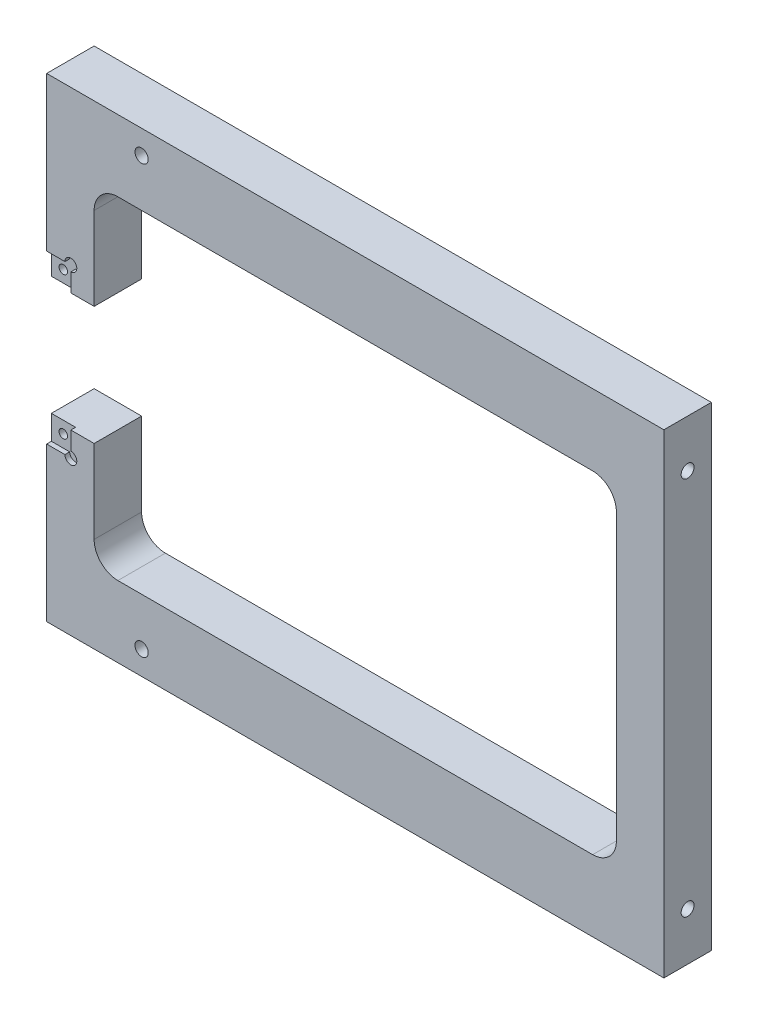
ISO-10303-21;
HEADER;
FILE_DESCRIPTION(('STEP AP214'),'2;1');
FILE_NAME('part.step','',(''),(''),'','','');
FILE_SCHEMA(('AUTOMOTIVE_DESIGN { 1 0 10303 214 1 1 1 1 }'));
ENDSEC;
DATA;
#1=APPLICATION_CONTEXT('core data for automotive mechanical design processes');
#2=APPLICATION_PROTOCOL_DEFINITION('international standard','automotive_design',2000,#1);
#3=PRODUCT_CONTEXT('',#1,'mechanical');
#4=PRODUCT('Part','Part','',(#3));
#5=PRODUCT_RELATED_PRODUCT_CATEGORY('part','',(#4));
#6=PRODUCT_DEFINITION_FORMATION('','',#4);
#7=PRODUCT_DEFINITION_CONTEXT('part definition',#1,'design');
#8=PRODUCT_DEFINITION('design','',#6,#7);
#9=PRODUCT_DEFINITION_SHAPE('','',#8);
#10=(LENGTH_UNIT() NAMED_UNIT(*) SI_UNIT(.MILLI.,.METRE.));
#11=(NAMED_UNIT(*) PLANE_ANGLE_UNIT() SI_UNIT($,.RADIAN.));
#12=(NAMED_UNIT(*) SI_UNIT($,.STERADIAN.) SOLID_ANGLE_UNIT());
#13=UNCERTAINTY_MEASURE_WITH_UNIT(LENGTH_MEASURE(1.E-05),#10,'distance_accuracy_value','');
#14=(GEOMETRIC_REPRESENTATION_CONTEXT(3) GLOBAL_UNCERTAINTY_ASSIGNED_CONTEXT((#13)) GLOBAL_UNIT_ASSIGNED_CONTEXT((#10,
#11,#12)) REPRESENTATION_CONTEXT('',''));
#15=CARTESIAN_POINT('',(0.,0.,0.));
#16=DIRECTION('',(0.,0.,1.));
#17=DIRECTION('',(1.,0.,0.));
#18=AXIS2_PLACEMENT_3D('',#15,#16,#17);
#19=CARTESIAN_POINT('',(-82.55,63.5,12.7));
#20=DIRECTION('',(1.,0.,0.));
#21=DIRECTION('',(0.,1.,0.));
#22=AXIS2_PLACEMENT_3D('',#19,#20,#21);
#23=PLANE('',#22);
#24=CARTESIAN_POINT('',(-82.55,50.8,6.35));
#25=DIRECTION('',(-1.,0.,0.));
#26=DIRECTION('',(0.,0.,1.));
#27=AXIS2_PLACEMENT_3D('',#24,#25,#26);
#28=CIRCLE('',#27,1.72719999999999);
#29=CARTESIAN_POINT('',(-82.55,50.8,8.07719999999999));
#30=VERTEX_POINT('',#29);
#31=EDGE_CURVE('E519',#30,#30,#28,.T.);
#32=ORIENTED_EDGE('',*,*,#31,.F.);
#33=EDGE_LOOP('',(#32));
#34=FACE_BOUND('',#33,.T.);
#35=DIRECTION('',(0.,0.,1.));
#36=VECTOR('',#35,1.);
#37=CARTESIAN_POINT('',(-82.55,22.352,11.43));
#38=LINE('',#37,#36);
#39=CARTESIAN_POINT('',(-82.55,22.352,11.43));
#40=VERTEX_POINT('',#39);
#41=CARTESIAN_POINT('',(-82.55,22.352,12.7));
#42=VERTEX_POINT('',#41);
#43=EDGE_CURVE('E235',#40,#42,#38,.T.);
#44=ORIENTED_EDGE('',*,*,#43,.T.);
#45=DIRECTION('',(0.,-1.,0.));
#46=VECTOR('',#45,1.);
#47=CARTESIAN_POINT('',(-82.55,63.5,12.7));
#48=LINE('',#47,#46);
#49=CARTESIAN_POINT('',(-82.55,63.5,12.7));
#50=VERTEX_POINT('',#49);
#51=EDGE_CURVE('E299',#50,#42,#48,.T.);
#52=ORIENTED_EDGE('',*,*,#51,.F.);
#53=DIRECTION('',(0.,0.,-1.));
#54=VECTOR('',#53,1.);
#55=CARTESIAN_POINT('',(-82.55,63.5,12.7));
#56=LINE('',#55,#54);
#57=CARTESIAN_POINT('',(-82.55,63.5,0.));
#58=VERTEX_POINT('',#57);
#59=EDGE_CURVE('E309',#50,#58,#56,.T.);
#60=ORIENTED_EDGE('',*,*,#59,.T.);
#61=DIRECTION('',(0.,-1.,0.));
#62=VECTOR('',#61,1.);
#63=CARTESIAN_POINT('',(-82.55,63.5,0.));
#64=LINE('',#63,#62);
#65=CARTESIAN_POINT('',(-82.55,15.875,0.));
#66=VERTEX_POINT('',#65);
#67=EDGE_CURVE('E310',#58,#66,#64,.T.);
#68=ORIENTED_EDGE('',*,*,#67,.T.);
#69=DIRECTION('',(0.,0.,-1.));
#70=VECTOR('',#69,1.);
#71=CARTESIAN_POINT('',(-82.55,15.875,12.7));
#72=LINE('',#71,#70);
#73=CARTESIAN_POINT('',(-82.55,15.875,11.43));
#74=VERTEX_POINT('',#73);
#75=EDGE_CURVE('E272',#74,#66,#72,.T.);
#76=ORIENTED_EDGE('',*,*,#75,.F.);
#77=DIRECTION('',(0.,-1.,0.));
#78=VECTOR('',#77,1.);
#79=CARTESIAN_POINT('',(-82.55,22.352,11.43));
#80=LINE('',#79,#78);
#81=EDGE_CURVE('E249',#40,#74,#80,.T.);
#82=ORIENTED_EDGE('',*,*,#81,.F.);
#83=EDGE_LOOP('',(#44,#52,#60,#68,#76,#82));
#84=FACE_BOUND('',#83,.T.);
#85=ADVANCED_FACE('F40',(#34,#84),#23,.F.);
#86=CARTESIAN_POINT('',(0.,0.,12.7));
#87=DIRECTION('',(0.,0.,1.));
#88=DIRECTION('',(1.,0.,0.));
#89=AXIS2_PLACEMENT_3D('',#86,#87,#88);
#90=PLANE('',#89);
#91=CARTESIAN_POINT('',(-76.073,22.352,12.7));
#92=DIRECTION('',(0.,0.,1.));
#93=DIRECTION('',(1.,0.,0.));
#94=AXIS2_PLACEMENT_3D('',#91,#92,#93);
#95=CIRCLE('',#94,1.5875);
#96=CARTESIAN_POINT('',(-76.073,20.7645,12.7));
#97=VERTEX_POINT('',#96);
#98=CARTESIAN_POINT('',(-77.6605,22.352,12.7));
#99=VERTEX_POINT('',#98);
#100=EDGE_CURVE('E216',#97,#99,#95,.T.);
#101=ORIENTED_EDGE('',*,*,#100,.F.);
#102=DIRECTION('',(0.,-1.,0.));
#103=VECTOR('',#102,1.);
#104=CARTESIAN_POINT('',(-76.073,22.352,12.7));
#105=LINE('',#104,#103);
#106=CARTESIAN_POINT('',(-76.073,15.875,12.7));
#107=VERTEX_POINT('',#106);
#108=EDGE_CURVE('E244',#97,#107,#105,.T.);
#109=ORIENTED_EDGE('',*,*,#108,.T.);
#110=DIRECTION('',(-1.,0.,0.));
#111=VECTOR('',#110,1.);
#112=CARTESIAN_POINT('',(-69.85,15.875,12.7));
#113=LINE('',#112,#111);
#114=CARTESIAN_POINT('',(-69.85,15.875,12.7));
#115=VERTEX_POINT('',#114);
#116=EDGE_CURVE('E269',#115,#107,#113,.T.);
#117=ORIENTED_EDGE('',*,*,#116,.F.);
#118=DIRECTION('',(0.,-1.,0.));
#119=VECTOR('',#118,1.);
#120=CARTESIAN_POINT('',(-69.85,44.45,12.7));
#121=LINE('',#120,#119);
#122=CARTESIAN_POINT('',(-69.85,38.1,12.7));
#123=VERTEX_POINT('',#122);
#124=EDGE_CURVE('E267',#123,#115,#121,.T.);
#125=ORIENTED_EDGE('',*,*,#124,.F.);
#126=CARTESIAN_POINT('',(-63.5,38.1,12.7));
#127=DIRECTION('',(0.,0.,1.));
#128=DIRECTION('',(1.,0.,0.));
#129=AXIS2_PLACEMENT_3D('',#126,#127,#128);
#130=CIRCLE('',#129,6.35);
#131=CARTESIAN_POINT('',(-63.5,44.45,12.7));
#132=VERTEX_POINT('',#131);
#133=EDGE_CURVE('E11',#123,#132,#130,.F.);
#134=ORIENTED_EDGE('',*,*,#133,.T.);
#135=DIRECTION('',(-1.,0.,0.));
#136=VECTOR('',#135,1.);
#137=CARTESIAN_POINT('',(69.85,44.45,12.7));
#138=LINE('',#137,#136);
#139=CARTESIAN_POINT('',(63.5,44.45,12.7));
#140=VERTEX_POINT('',#139);
#141=EDGE_CURVE('E264',#140,#132,#138,.T.);
#142=ORIENTED_EDGE('',*,*,#141,.F.);
#143=CARTESIAN_POINT('',(63.5,38.1,12.7));
#144=DIRECTION('',(0.,0.,1.));
#145=DIRECTION('',(1.,0.,0.));
#146=AXIS2_PLACEMENT_3D('',#143,#144,#145);
#147=CIRCLE('',#146,6.35);
#148=CARTESIAN_POINT('',(69.85,38.1,12.7));
#149=VERTEX_POINT('',#148);
#150=EDGE_CURVE('E359',#140,#149,#147,.F.);
#151=ORIENTED_EDGE('',*,*,#150,.T.);
#152=DIRECTION('',(0.,1.,0.));
#153=VECTOR('',#152,1.);
#154=CARTESIAN_POINT('',(69.85,-44.45,12.7));
#155=LINE('',#154,#153);
#156=CARTESIAN_POINT('',(69.85,-38.1,12.7));
#157=VERTEX_POINT('',#156);
#158=EDGE_CURVE('E261',#157,#149,#155,.T.);
#159=ORIENTED_EDGE('',*,*,#158,.F.);
#160=CARTESIAN_POINT('',(63.5,-38.1,12.7));
#161=DIRECTION('',(0.,0.,1.));
#162=DIRECTION('',(1.,0.,0.));
#163=AXIS2_PLACEMENT_3D('',#160,#161,#162);
#164=CIRCLE('',#163,6.35);
#165=CARTESIAN_POINT('',(63.4999999999999,-44.45,12.7));
#166=VERTEX_POINT('',#165);
#167=EDGE_CURVE('E355',#157,#166,#164,.F.);
#168=ORIENTED_EDGE('',*,*,#167,.T.);
#169=DIRECTION('',(1.,0.,0.));
#170=VECTOR('',#169,1.);
#171=CARTESIAN_POINT('',(-69.85,-44.45,12.7));
#172=LINE('',#171,#170);
#173=CARTESIAN_POINT('',(-63.5,-44.45,12.7));
#174=VERTEX_POINT('',#173);
#175=EDGE_CURVE('E258',#174,#166,#172,.T.);
#176=ORIENTED_EDGE('',*,*,#175,.F.);
#177=CARTESIAN_POINT('',(-63.5,-38.1,12.7));
#178=DIRECTION('',(0.,0.,1.));
#179=DIRECTION('',(1.,0.,0.));
#180=AXIS2_PLACEMENT_3D('',#177,#178,#179);
#181=CIRCLE('',#180,6.35);
#182=CARTESIAN_POINT('',(-69.85,-38.1,12.7));
#183=VERTEX_POINT('',#182);
#184=EDGE_CURVE('E337',#174,#183,#181,.F.);
#185=ORIENTED_EDGE('',*,*,#184,.T.);
#186=DIRECTION('',(0.,-1.,0.));
#187=VECTOR('',#186,1.);
#188=CARTESIAN_POINT('',(-69.85,-15.875,12.7));
#189=LINE('',#188,#187);
#190=CARTESIAN_POINT('',(-69.85,-15.875,12.7));
#191=VERTEX_POINT('',#190);
#192=EDGE_CURVE('E254',#191,#183,#189,.T.);
#193=ORIENTED_EDGE('',*,*,#192,.F.);
#194=DIRECTION('',(1.,0.,0.));
#195=VECTOR('',#194,1.);
#196=CARTESIAN_POINT('',(-82.55,-15.875,12.7));
#197=LINE('',#196,#195);
#198=CARTESIAN_POINT('',(-76.073,-15.875,12.7));
#199=VERTEX_POINT('',#198);
#200=EDGE_CURVE('E252',#199,#191,#197,.T.);
#201=ORIENTED_EDGE('',*,*,#200,.F.);
#202=DIRECTION('',(0.,1.,0.));
#203=VECTOR('',#202,1.);
#204=CARTESIAN_POINT('',(-76.073,-15.875,12.7));
#205=LINE('',#204,#203);
#206=CARTESIAN_POINT('',(-76.073,-20.7645,12.7));
#207=VERTEX_POINT('',#206);
#208=EDGE_CURVE('E442',#207,#199,#205,.T.);
#209=ORIENTED_EDGE('',*,*,#208,.F.);
#210=CARTESIAN_POINT('',(-76.073,-22.352,12.7));
#211=DIRECTION('',(0.,0.,1.));
#212=DIRECTION('',(1.,0.,0.));
#213=AXIS2_PLACEMENT_3D('',#210,#211,#212);
#214=CIRCLE('',#213,1.5875);
#215=CARTESIAN_POINT('',(-77.6605,-22.352,12.7));
#216=VERTEX_POINT('',#215);
#217=EDGE_CURVE('E220',#216,#207,#214,.T.);
#218=ORIENTED_EDGE('',*,*,#217,.F.);
#219=DIRECTION('',(1.,0.,0.));
#220=VECTOR('',#219,1.);
#221=CARTESIAN_POINT('',(-82.55,-22.352,12.7));
#222=LINE('',#221,#220);
#223=CARTESIAN_POINT('',(-82.55,-22.352,12.7));
#224=VERTEX_POINT('',#223);
#225=EDGE_CURVE('E449',#224,#216,#222,.T.);
#226=ORIENTED_EDGE('',*,*,#225,.F.);
#227=CARTESIAN_POINT('',(-82.55,-63.5,12.7));
#228=VERTEX_POINT('',#227);
#229=EDGE_CURVE('E303',#224,#228,#48,.T.);
#230=ORIENTED_EDGE('',*,*,#229,.T.);
#231=DIRECTION('',(1.,0.,0.));
#232=VECTOR('',#231,1.);
#233=CARTESIAN_POINT('',(-82.55,-63.5,12.7));
#234=LINE('',#233,#232);
#235=CARTESIAN_POINT('',(82.55,-63.5,12.7));
#236=VERTEX_POINT('',#235);
#237=EDGE_CURVE('E302',#228,#236,#234,.T.);
#238=ORIENTED_EDGE('',*,*,#237,.T.);
#239=DIRECTION('',(0.,1.,0.));
#240=VECTOR('',#239,1.);
#241=CARTESIAN_POINT('',(82.55,63.5,12.7));
#242=LINE('',#241,#240);
#243=CARTESIAN_POINT('',(82.55,63.5,12.7));
#244=VERTEX_POINT('',#243);
#245=EDGE_CURVE('E305',#236,#244,#242,.T.);
#246=ORIENTED_EDGE('',*,*,#245,.T.);
#247=DIRECTION('',(-1.,0.,0.));
#248=VECTOR('',#247,1.);
#249=CARTESIAN_POINT('',(-82.55,63.5,12.7));
#250=LINE('',#249,#248);
#251=EDGE_CURVE('E307',#244,#50,#250,.T.);
#252=ORIENTED_EDGE('',*,*,#251,.T.);
#253=ORIENTED_EDGE('',*,*,#51,.T.);
#254=DIRECTION('',(1.,0.,0.));
#255=VECTOR('',#254,1.);
#256=CARTESIAN_POINT('',(-82.55,22.352,12.7));
#257=LINE('',#256,#255);
#258=EDGE_CURVE('E246',#42,#99,#257,.T.);
#259=ORIENTED_EDGE('',*,*,#258,.T.);
#260=EDGE_LOOP('',(#101,#109,#117,#125,#134,#142,#151,#159,#168,#176,#185,#193,#201,#209,#218,
#226,#230,#238,#246,#252,#253,#259));
#261=FACE_BOUND('',#260,.T.);
#262=CARTESIAN_POINT('',(-57.15,57.15,12.7));
#263=DIRECTION('',(0.,0.,1.));
#264=DIRECTION('',(1.,0.,0.));
#265=AXIS2_PLACEMENT_3D('',#262,#263,#264);
#266=CIRCLE('',#265,1.778);
#267=CARTESIAN_POINT('',(-55.372,57.15,12.7));
#268=VERTEX_POINT('',#267);
#269=EDGE_CURVE('E477',#268,#268,#266,.T.);
#270=ORIENTED_EDGE('',*,*,#269,.F.);
#271=EDGE_LOOP('',(#270));
#272=FACE_BOUND('',#271,.T.);
#273=CARTESIAN_POINT('',(-57.15,-57.15,12.7));
#274=DIRECTION('',(0.,0.,1.));
#275=DIRECTION('',(1.,0.,0.));
#276=AXIS2_PLACEMENT_3D('',#273,#274,#275);
#277=CIRCLE('',#276,1.778);
#278=CARTESIAN_POINT('',(-55.372,-57.15,12.7));
#279=VERTEX_POINT('',#278);
#280=EDGE_CURVE('E481',#279,#279,#277,.T.);
#281=ORIENTED_EDGE('',*,*,#280,.F.);
#282=EDGE_LOOP('',(#281));
#283=FACE_BOUND('',#282,.T.);
#284=ADVANCED_FACE('F364',(#261,#272,#283),#90,.T.);
#285=CARTESIAN_POINT('',(-69.85,15.875,12.7));
#286=DIRECTION('',(0.,-1.,0.));
#287=DIRECTION('',(1.,0.,0.));
#288=AXIS2_PLACEMENT_3D('',#285,#286,#287);
#289=PLANE('',#288);
#290=ORIENTED_EDGE('',*,*,#116,.T.);
#291=DIRECTION('',(0.,0.,1.));
#292=VECTOR('',#291,1.);
#293=CARTESIAN_POINT('',(-76.073,15.875,11.43));
#294=LINE('',#293,#292);
#295=CARTESIAN_POINT('',(-76.073,15.875,11.43));
#296=VERTEX_POINT('',#295);
#297=EDGE_CURVE('E236',#296,#107,#294,.T.);
#298=ORIENTED_EDGE('',*,*,#297,.F.);
#299=DIRECTION('',(1.,0.,0.));
#300=VECTOR('',#299,1.);
#301=CARTESIAN_POINT('',(-82.55,15.875,11.43));
#302=LINE('',#301,#300);
#303=EDGE_CURVE('E240',#74,#296,#302,.T.);
#304=ORIENTED_EDGE('',*,*,#303,.F.);
#305=ORIENTED_EDGE('',*,*,#75,.T.);
#306=DIRECTION('',(-1.,0.,0.));
#307=VECTOR('',#306,1.);
#308=CARTESIAN_POINT('',(-69.85,15.875,0.));
#309=LINE('',#308,#307);
#310=CARTESIAN_POINT('',(-69.85,15.875,0.));
#311=VERTEX_POINT('',#310);
#312=EDGE_CURVE('E255',#311,#66,#309,.T.);
#313=ORIENTED_EDGE('',*,*,#312,.F.);
#314=DIRECTION('',(0.,0.,-1.));
#315=VECTOR('',#314,1.);
#316=CARTESIAN_POINT('',(-69.85,15.875,12.7));
#317=LINE('',#316,#315);
#318=EDGE_CURVE('E291',#115,#311,#317,.T.);
#319=ORIENTED_EDGE('',*,*,#318,.F.);
#320=EDGE_LOOP('',(#290,#298,#304,#305,#313,#319));
#321=FACE_BOUND('',#320,.T.);
#322=ADVANCED_FACE('F387',(#321),#289,.T.);
#323=CARTESIAN_POINT('',(-82.55,-50.6898754033906,6.35));
#324=DIRECTION('',(-1.,0.,0.));
#325=DIRECTION('',(0.,0.,1.));
#326=AXIS2_PLACEMENT_3D('',#323,#324,#325);
#327=CIRCLE('',#326,1.72719999999999);
#328=CARTESIAN_POINT('',(-82.55,-50.6898754033906,8.07719999999999));
#329=VERTEX_POINT('',#328);
#330=EDGE_CURVE('E513',#329,#329,#327,.T.);
#331=ORIENTED_EDGE('',*,*,#330,.F.);
#332=EDGE_LOOP('',(#331));
#333=FACE_BOUND('',#332,.T.);
#334=ORIENTED_EDGE('',*,*,#229,.F.);
#335=DIRECTION('',(0.,0.,1.));
#336=VECTOR('',#335,1.);
#337=CARTESIAN_POINT('',(-82.55,-22.352,11.43));
#338=LINE('',#337,#336);
#339=CARTESIAN_POINT('',(-82.55,-22.352,11.43));
#340=VERTEX_POINT('',#339);
#341=EDGE_CURVE('E459',#340,#224,#338,.T.);
#342=ORIENTED_EDGE('',*,*,#341,.F.);
#343=DIRECTION('',(0.,-1.,0.));
#344=VECTOR('',#343,1.);
#345=CARTESIAN_POINT('',(-82.55,-15.875,11.43));
#346=LINE('',#345,#344);
#347=CARTESIAN_POINT('',(-82.55,-15.875,11.43));
#348=VERTEX_POINT('',#347);
#349=EDGE_CURVE('E448',#348,#340,#346,.T.);
#350=ORIENTED_EDGE('',*,*,#349,.F.);
#351=DIRECTION('',(0.,0.,-1.));
#352=VECTOR('',#351,1.);
#353=CARTESIAN_POINT('',(-82.55,-15.875,12.7));
#354=LINE('',#353,#352);
#355=CARTESIAN_POINT('',(-82.55,-15.875,0.));
#356=VERTEX_POINT('',#355);
#357=EDGE_CURVE('E296',#348,#356,#354,.T.);
#358=ORIENTED_EDGE('',*,*,#357,.T.);
#359=CARTESIAN_POINT('',(-82.55,-63.5,0.));
#360=VERTEX_POINT('',#359);
#361=EDGE_CURVE('E298',#356,#360,#64,.T.);
#362=ORIENTED_EDGE('',*,*,#361,.T.);
#363=DIRECTION('',(0.,0.,-1.));
#364=VECTOR('',#363,1.);
#365=CARTESIAN_POINT('',(-82.55,-63.5,12.7));
#366=LINE('',#365,#364);
#367=EDGE_CURVE('E327',#228,#360,#366,.T.);
#368=ORIENTED_EDGE('',*,*,#367,.F.);
#369=EDGE_LOOP('',(#334,#342,#350,#358,#362,#368));
#370=FACE_BOUND('',#369,.T.);
#371=ADVANCED_FACE('F413',(#333,#370),#23,.F.);
#372=CARTESIAN_POINT('',(0.,0.,0.));
#373=DIRECTION('',(0.,0.,1.));
#374=DIRECTION('',(1.,0.,0.));
#375=AXIS2_PLACEMENT_3D('',#372,#373,#374);
#376=PLANE('',#375);
#377=CARTESIAN_POINT('',(-57.15,57.15,0.));
#378=DIRECTION('',(0.,0.,1.));
#379=DIRECTION('',(1.,0.,0.));
#380=AXIS2_PLACEMENT_3D('',#377,#378,#379);
#381=CIRCLE('',#380,1.778);
#382=CARTESIAN_POINT('',(-55.372,57.15,0.));
#383=VERTEX_POINT('',#382);
#384=EDGE_CURVE('E478',#383,#383,#381,.T.);
#385=ORIENTED_EDGE('',*,*,#384,.T.);
#386=EDGE_LOOP('',(#385));
#387=FACE_BOUND('',#386,.T.);
#388=CARTESIAN_POINT('',(-57.15,-57.15,0.));
#389=DIRECTION('',(0.,0.,1.));
#390=DIRECTION('',(1.,0.,0.));
#391=AXIS2_PLACEMENT_3D('',#388,#389,#390);
#392=CIRCLE('',#391,1.778);
#393=CARTESIAN_POINT('',(-55.372,-57.15,0.));
#394=VERTEX_POINT('',#393);
#395=EDGE_CURVE('E484',#394,#394,#392,.T.);
#396=ORIENTED_EDGE('',*,*,#395,.T.);
#397=EDGE_LOOP('',(#396));
#398=FACE_BOUND('',#397,.T.);
#399=CARTESIAN_POINT('',(-79.375,-19.05,0.));
#400=DIRECTION('',(0.,0.,1.));
#401=DIRECTION('',(1.,0.,0.));
#402=AXIS2_PLACEMENT_3D('',#399,#400,#401);
#403=CIRCLE('',#402,1.1303);
#404=CARTESIAN_POINT('',(-78.2447,-19.05,0.));
#405=VERTEX_POINT('',#404);
#406=EDGE_CURVE('E492',#405,#405,#403,.T.);
#407=ORIENTED_EDGE('',*,*,#406,.T.);
#408=EDGE_LOOP('',(#407));
#409=FACE_BOUND('',#408,.T.);
#410=CARTESIAN_POINT('',(-79.375,19.05,0.));
#411=DIRECTION('',(0.,0.,1.));
#412=DIRECTION('',(1.,0.,0.));
#413=AXIS2_PLACEMENT_3D('',#410,#411,#412);
#414=CIRCLE('',#413,1.1303);
#415=CARTESIAN_POINT('',(-78.2447,19.05,0.));
#416=VERTEX_POINT('',#415);
#417=EDGE_CURVE('E498',#416,#416,#414,.T.);
#418=ORIENTED_EDGE('',*,*,#417,.T.);
#419=EDGE_LOOP('',(#418));
#420=FACE_BOUND('',#419,.T.);
#421=DIRECTION('',(1.,0.,0.));
#422=VECTOR('',#421,1.);
#423=CARTESIAN_POINT('',(-82.55,-15.875,0.));
#424=LINE('',#423,#422);
#425=CARTESIAN_POINT('',(-69.85,-15.875,0.));
#426=VERTEX_POINT('',#425);
#427=EDGE_CURVE('E250',#356,#426,#424,.T.);
#428=ORIENTED_EDGE('',*,*,#427,.T.);
#429=DIRECTION('',(0.,-1.,0.));
#430=VECTOR('',#429,1.);
#431=CARTESIAN_POINT('',(-69.85,-15.875,0.));
#432=LINE('',#431,#430);
#433=CARTESIAN_POINT('',(-69.85,-38.1,0.));
#434=VERTEX_POINT('',#433);
#435=EDGE_CURVE('E275',#426,#434,#432,.T.);
#436=ORIENTED_EDGE('',*,*,#435,.T.);
#437=CARTESIAN_POINT('',(-63.5,-38.1,0.));
#438=DIRECTION('',(0.,0.,1.));
#439=DIRECTION('',(1.,0.,0.));
#440=AXIS2_PLACEMENT_3D('',#437,#438,#439);
#441=CIRCLE('',#440,6.35);
#442=CARTESIAN_POINT('',(-63.5,-44.45,0.));
#443=VERTEX_POINT('',#442);
#444=EDGE_CURVE('E335',#434,#443,#441,.T.);
#445=ORIENTED_EDGE('',*,*,#444,.T.);
#446=DIRECTION('',(1.,0.,0.));
#447=VECTOR('',#446,1.);
#448=CARTESIAN_POINT('',(-69.85,-44.45,0.));
#449=LINE('',#448,#447);
#450=CARTESIAN_POINT('',(63.4999999999999,-44.45,0.));
#451=VERTEX_POINT('',#450);
#452=EDGE_CURVE('E278',#443,#451,#449,.T.);
#453=ORIENTED_EDGE('',*,*,#452,.T.);
#454=CARTESIAN_POINT('',(63.5,-38.1,0.));
#455=DIRECTION('',(0.,0.,1.));
#456=DIRECTION('',(1.,0.,0.));
#457=AXIS2_PLACEMENT_3D('',#454,#455,#456);
#458=CIRCLE('',#457,6.35);
#459=CARTESIAN_POINT('',(69.85,-38.1,0.));
#460=VERTEX_POINT('',#459);
#461=EDGE_CURVE('E353',#451,#460,#458,.T.);
#462=ORIENTED_EDGE('',*,*,#461,.T.);
#463=DIRECTION('',(0.,1.,0.));
#464=VECTOR('',#463,1.);
#465=CARTESIAN_POINT('',(69.85,-44.45,0.));
#466=LINE('',#465,#464);
#467=CARTESIAN_POINT('',(69.85,38.1,0.));
#468=VERTEX_POINT('',#467);
#469=EDGE_CURVE('E281',#460,#468,#466,.T.);
#470=ORIENTED_EDGE('',*,*,#469,.T.);
#471=CARTESIAN_POINT('',(63.5,38.1,0.));
#472=DIRECTION('',(0.,0.,1.));
#473=DIRECTION('',(1.,0.,0.));
#474=AXIS2_PLACEMENT_3D('',#471,#472,#473);
#475=CIRCLE('',#474,6.35);
#476=CARTESIAN_POINT('',(63.5,44.45,0.));
#477=VERTEX_POINT('',#476);
#478=EDGE_CURVE('E357',#468,#477,#475,.T.);
#479=ORIENTED_EDGE('',*,*,#478,.T.);
#480=DIRECTION('',(-1.,0.,0.));
#481=VECTOR('',#480,1.);
#482=CARTESIAN_POINT('',(69.85,44.45,0.));
#483=LINE('',#482,#481);
#484=CARTESIAN_POINT('',(-63.5,44.45,0.));
#485=VERTEX_POINT('',#484);
#486=EDGE_CURVE('E284',#477,#485,#483,.T.);
#487=ORIENTED_EDGE('',*,*,#486,.T.);
#488=CARTESIAN_POINT('',(-63.5,38.1,0.));
#489=DIRECTION('',(0.,0.,1.));
#490=DIRECTION('',(1.,0.,0.));
#491=AXIS2_PLACEMENT_3D('',#488,#489,#490);
#492=CIRCLE('',#491,6.35);
#493=CARTESIAN_POINT('',(-69.85,38.1,0.));
#494=VERTEX_POINT('',#493);
#495=EDGE_CURVE('E48',#485,#494,#492,.T.);
#496=ORIENTED_EDGE('',*,*,#495,.T.);
#497=DIRECTION('',(0.,-1.,0.));
#498=VECTOR('',#497,1.);
#499=CARTESIAN_POINT('',(-69.85,44.45,0.));
#500=LINE('',#499,#498);
#501=EDGE_CURVE('E286',#494,#311,#500,.T.);
#502=ORIENTED_EDGE('',*,*,#501,.T.);
#503=ORIENTED_EDGE('',*,*,#312,.T.);
#504=ORIENTED_EDGE('',*,*,#67,.F.);
#505=DIRECTION('',(-1.,0.,0.));
#506=VECTOR('',#505,1.);
#507=CARTESIAN_POINT('',(-82.55,63.5,0.));
#508=LINE('',#507,#506);
#509=CARTESIAN_POINT('',(82.55,63.5,0.));
#510=VERTEX_POINT('',#509);
#511=EDGE_CURVE('E317',#510,#58,#508,.T.);
#512=ORIENTED_EDGE('',*,*,#511,.F.);
#513=DIRECTION('',(0.,1.,0.));
#514=VECTOR('',#513,1.);
#515=CARTESIAN_POINT('',(82.55,63.5,0.));
#516=LINE('',#515,#514);
#517=CARTESIAN_POINT('',(82.55,-63.5,0.));
#518=VERTEX_POINT('',#517);
#519=EDGE_CURVE('E315',#518,#510,#516,.T.);
#520=ORIENTED_EDGE('',*,*,#519,.F.);
#521=DIRECTION('',(1.,0.,0.));
#522=VECTOR('',#521,1.);
#523=CARTESIAN_POINT('',(-82.55,-63.5,0.));
#524=LINE('',#523,#522);
#525=EDGE_CURVE('E313',#360,#518,#524,.T.);
#526=ORIENTED_EDGE('',*,*,#525,.F.);
#527=ORIENTED_EDGE('',*,*,#361,.F.);
#528=EDGE_LOOP('',(#428,#436,#445,#453,#462,#470,#479,#487,#496,#502,#503,#504,#512,#520,#526,#527));
#529=FACE_BOUND('',#528,.T.);
#530=ADVANCED_FACE('F376',(#387,#398,#409,#420,#529),#376,.F.);
#531=CARTESIAN_POINT('',(-82.55,-63.5,12.7));
#532=DIRECTION('',(0.,1.,0.));
#533=DIRECTION('',(0.,0.,1.));
#534=AXIS2_PLACEMENT_3D('',#531,#532,#533);
#535=PLANE('',#534);
#536=ORIENTED_EDGE('',*,*,#525,.T.);
#537=DIRECTION('',(0.,0.,-1.));
#538=VECTOR('',#537,1.);
#539=CARTESIAN_POINT('',(82.55,-63.5,12.7));
#540=LINE('',#539,#538);
#541=EDGE_CURVE('E324',#236,#518,#540,.T.);
#542=ORIENTED_EDGE('',*,*,#541,.F.);
#543=ORIENTED_EDGE('',*,*,#237,.F.);
#544=ORIENTED_EDGE('',*,*,#367,.T.);
#545=EDGE_LOOP('',(#536,#542,#543,#544));
#546=FACE_BOUND('',#545,.T.);
#547=ADVANCED_FACE('F409',(#546),#535,.F.);
#548=CARTESIAN_POINT('',(82.55,63.5,12.7));
#549=DIRECTION('',(-1.,0.,0.));
#550=DIRECTION('',(0.,-1.,0.));
#551=AXIS2_PLACEMENT_3D('',#548,#549,#550);
#552=PLANE('',#551);
#553=CARTESIAN_POINT('',(82.55,-50.6898754033906,6.35));
#554=DIRECTION('',(1.,0.,0.));
#555=DIRECTION('',(0.,0.,-1.));
#556=AXIS2_PLACEMENT_3D('',#553,#554,#555);
#557=CIRCLE('',#556,1.72719999999999);
#558=CARTESIAN_POINT('',(82.55,-50.6898754033906,4.62280000000001));
#559=VERTEX_POINT('',#558);
#560=EDGE_CURVE('E501',#559,#559,#557,.T.);
#561=ORIENTED_EDGE('',*,*,#560,.F.);
#562=EDGE_LOOP('',(#561));
#563=FACE_BOUND('',#562,.T.);
#564=CARTESIAN_POINT('',(82.55,50.8,6.35));
#565=DIRECTION('',(1.,0.,0.));
#566=DIRECTION('',(0.,0.,-1.));
#567=AXIS2_PLACEMENT_3D('',#564,#565,#566);
#568=CIRCLE('',#567,1.72719999999999);
#569=CARTESIAN_POINT('',(82.55,50.8,4.62280000000001));
#570=VERTEX_POINT('',#569);
#571=EDGE_CURVE('E507',#570,#570,#568,.T.);
#572=ORIENTED_EDGE('',*,*,#571,.F.);
#573=EDGE_LOOP('',(#572));
#574=FACE_BOUND('',#573,.T.);
#575=ORIENTED_EDGE('',*,*,#519,.T.);
#576=DIRECTION('',(0.,0.,-1.));
#577=VECTOR('',#576,1.);
#578=CARTESIAN_POINT('',(82.55,63.5,12.7));
#579=LINE('',#578,#577);
#580=EDGE_CURVE('E321',#244,#510,#579,.T.);
#581=ORIENTED_EDGE('',*,*,#580,.F.);
#582=ORIENTED_EDGE('',*,*,#245,.F.);
#583=ORIENTED_EDGE('',*,*,#541,.T.);
#584=EDGE_LOOP('',(#575,#581,#582,#583));
#585=FACE_BOUND('',#584,.T.);
#586=ADVANCED_FACE('F404',(#563,#574,#585),#552,.F.);
#587=CARTESIAN_POINT('',(-82.55,63.5,12.7));
#588=DIRECTION('',(0.,-1.,0.));
#589=DIRECTION('',(0.,0.,-1.));
#590=AXIS2_PLACEMENT_3D('',#587,#588,#589);
#591=PLANE('',#590);
#592=ORIENTED_EDGE('',*,*,#511,.T.);
#593=ORIENTED_EDGE('',*,*,#59,.F.);
#594=ORIENTED_EDGE('',*,*,#251,.F.);
#595=ORIENTED_EDGE('',*,*,#580,.T.);
#596=EDGE_LOOP('',(#592,#593,#594,#595));
#597=FACE_BOUND('',#596,.T.);
#598=ADVANCED_FACE('F398',(#597),#591,.F.);
#599=CARTESIAN_POINT('',(-82.55,-15.875,12.7));
#600=DIRECTION('',(0.,1.,0.));
#601=DIRECTION('',(0.,0.,1.));
#602=AXIS2_PLACEMENT_3D('',#599,#600,#601);
#603=PLANE('',#602);
#604=DIRECTION('',(0.,0.,1.));
#605=VECTOR('',#604,1.);
#606=CARTESIAN_POINT('',(-76.073,-15.875,11.43));
#607=LINE('',#606,#605);
#608=CARTESIAN_POINT('',(-76.073,-15.875,11.43));
#609=VERTEX_POINT('',#608);
#610=EDGE_CURVE('E247',#609,#199,#607,.T.);
#611=ORIENTED_EDGE('',*,*,#610,.T.);
#612=ORIENTED_EDGE('',*,*,#200,.T.);
#613=DIRECTION('',(0.,0.,-1.));
#614=VECTOR('',#613,1.);
#615=CARTESIAN_POINT('',(-69.85,-15.875,12.7));
#616=LINE('',#615,#614);
#617=EDGE_CURVE('E294',#191,#426,#616,.T.);
#618=ORIENTED_EDGE('',*,*,#617,.T.);
#619=ORIENTED_EDGE('',*,*,#427,.F.);
#620=ORIENTED_EDGE('',*,*,#357,.F.);
#621=DIRECTION('',(-1.,0.,0.));
#622=VECTOR('',#621,1.);
#623=CARTESIAN_POINT('',(-82.55,-15.875,11.43));
#624=LINE('',#623,#622);
#625=EDGE_CURVE('E461',#609,#348,#624,.T.);
#626=ORIENTED_EDGE('',*,*,#625,.F.);
#627=EDGE_LOOP('',(#611,#612,#618,#619,#620,#626));
#628=FACE_BOUND('',#627,.T.);
#629=ADVANCED_FACE('F421',(#628),#603,.T.);
#630=CARTESIAN_POINT('',(-69.85,-15.875,12.7));
#631=DIRECTION('',(1.,0.,0.));
#632=DIRECTION('',(0.,1.,0.));
#633=AXIS2_PLACEMENT_3D('',#630,#631,#632);
#634=PLANE('',#633);
#635=ORIENTED_EDGE('',*,*,#192,.T.);
#636=DIRECTION('',(0.,0.,-1.));
#637=VECTOR('',#636,1.);
#638=CARTESIAN_POINT('',(-69.85,-38.1,0.));
#639=LINE('',#638,#637);
#640=EDGE_CURVE('E330',#183,#434,#639,.T.);
#641=ORIENTED_EDGE('',*,*,#640,.T.);
#642=ORIENTED_EDGE('',*,*,#435,.F.);
#643=ORIENTED_EDGE('',*,*,#617,.F.);
#644=EDGE_LOOP('',(#635,#641,#642,#643));
#645=FACE_BOUND('',#644,.T.);
#646=ADVANCED_FACE('F427',(#645),#634,.T.);
#647=CARTESIAN_POINT('',(-69.85,-44.45,12.7));
#648=DIRECTION('',(0.,1.,0.));
#649=DIRECTION('',(0.,0.,1.));
#650=AXIS2_PLACEMENT_3D('',#647,#648,#649);
#651=PLANE('',#650);
#652=ORIENTED_EDGE('',*,*,#175,.T.);
#653=DIRECTION('',(0.,0.,-1.));
#654=VECTOR('',#653,1.);
#655=CARTESIAN_POINT('',(63.5,-44.45,0.));
#656=LINE('',#655,#654);
#657=EDGE_CURVE('E339',#166,#451,#656,.T.);
#658=ORIENTED_EDGE('',*,*,#657,.T.);
#659=ORIENTED_EDGE('',*,*,#452,.F.);
#660=DIRECTION('',(0.,0.,-1.));
#661=VECTOR('',#660,1.);
#662=CARTESIAN_POINT('',(-63.5,-44.45,12.7));
#663=LINE('',#662,#661);
#664=EDGE_CURVE('E333',#443,#174,#663,.F.);
#665=ORIENTED_EDGE('',*,*,#664,.T.);
#666=EDGE_LOOP('',(#652,#658,#659,#665));
#667=FACE_BOUND('',#666,.T.);
#668=ADVANCED_FACE('F435',(#667),#651,.T.);
#669=CARTESIAN_POINT('',(69.85,-44.45,12.7));
#670=DIRECTION('',(-1.,0.,0.));
#671=DIRECTION('',(0.,0.,1.));
#672=AXIS2_PLACEMENT_3D('',#669,#670,#671);
#673=PLANE('',#672);
#674=ORIENTED_EDGE('',*,*,#469,.F.);
#675=DIRECTION('',(0.,0.,-1.));
#676=VECTOR('',#675,1.);
#677=CARTESIAN_POINT('',(69.85,-38.1,12.7));
#678=LINE('',#677,#676);
#679=EDGE_CURVE('E345',#460,#157,#678,.F.);
#680=ORIENTED_EDGE('',*,*,#679,.T.);
#681=ORIENTED_EDGE('',*,*,#158,.T.);
#682=DIRECTION('',(0.,0.,-1.));
#683=VECTOR('',#682,1.);
#684=CARTESIAN_POINT('',(69.85,38.1,0.));
#685=LINE('',#684,#683);
#686=EDGE_CURVE('E342',#149,#468,#685,.T.);
#687=ORIENTED_EDGE('',*,*,#686,.T.);
#688=EDGE_LOOP('',(#674,#680,#681,#687));
#689=FACE_BOUND('',#688,.T.);
#690=ADVANCED_FACE('F372',(#689),#673,.T.);
#691=CARTESIAN_POINT('',(69.85,44.45,12.7));
#692=DIRECTION('',(0.,-1.,0.));
#693=DIRECTION('',(1.,0.,0.));
#694=AXIS2_PLACEMENT_3D('',#691,#692,#693);
#695=PLANE('',#694);
#696=ORIENTED_EDGE('',*,*,#486,.F.);
#697=DIRECTION('',(0.,0.,-1.));
#698=VECTOR('',#697,1.);
#699=CARTESIAN_POINT('',(63.5,44.45,12.7));
#700=LINE('',#699,#698);
#701=EDGE_CURVE('E350',#477,#140,#700,.F.);
#702=ORIENTED_EDGE('',*,*,#701,.T.);
#703=ORIENTED_EDGE('',*,*,#141,.T.);
#704=DIRECTION('',(0.,0.,-1.));
#705=VECTOR('',#704,1.);
#706=CARTESIAN_POINT('',(-63.5,44.45,0.));
#707=LINE('',#706,#705);
#708=EDGE_CURVE('E347',#132,#485,#707,.T.);
#709=ORIENTED_EDGE('',*,*,#708,.T.);
#710=EDGE_LOOP('',(#696,#702,#703,#709));
#711=FACE_BOUND('',#710,.T.);
#712=ADVANCED_FACE('F378',(#711),#695,.T.);
#713=CARTESIAN_POINT('',(-69.85,44.45,12.7));
#714=DIRECTION('',(1.,0.,0.));
#715=DIRECTION('',(0.,0.,-1.));
#716=AXIS2_PLACEMENT_3D('',#713,#714,#715);
#717=PLANE('',#716);
#718=ORIENTED_EDGE('',*,*,#501,.F.);
#719=DIRECTION('',(0.,0.,-1.));
#720=VECTOR('',#719,1.);
#721=CARTESIAN_POINT('',(-69.85,38.1,12.7));
#722=LINE('',#721,#720);
#723=EDGE_CURVE('E55',#494,#123,#722,.F.);
#724=ORIENTED_EDGE('',*,*,#723,.T.);
#725=ORIENTED_EDGE('',*,*,#124,.T.);
#726=ORIENTED_EDGE('',*,*,#318,.T.);
#727=EDGE_LOOP('',(#718,#724,#725,#726));
#728=FACE_BOUND('',#727,.T.);
#729=ADVANCED_FACE('F384',(#728),#717,.T.);
#730=CARTESIAN_POINT('',(-82.55,22.352,11.43));
#731=DIRECTION('',(0.,-1.,0.));
#732=DIRECTION('',(0.,0.,-1.));
#733=AXIS2_PLACEMENT_3D('',#730,#731,#732);
#734=PLANE('',#733);
#735=DIRECTION('',(0.,0.,1.));
#736=VECTOR('',#735,1.);
#737=CARTESIAN_POINT('',(-77.6605,22.352,11.43));
#738=LINE('',#737,#736);
#739=CARTESIAN_POINT('',(-77.6605,22.352,11.43));
#740=VERTEX_POINT('',#739);
#741=EDGE_CURVE('E210',#99,#740,#738,.F.);
#742=ORIENTED_EDGE('',*,*,#741,.F.);
#743=ORIENTED_EDGE('',*,*,#258,.F.);
#744=ORIENTED_EDGE('',*,*,#43,.F.);
#745=DIRECTION('',(1.,0.,0.));
#746=VECTOR('',#745,1.);
#747=CARTESIAN_POINT('',(-82.55,22.352,11.43));
#748=LINE('',#747,#746);
#749=EDGE_CURVE('E228',#40,#740,#748,.T.);
#750=ORIENTED_EDGE('',*,*,#749,.T.);
#751=EDGE_LOOP('',(#742,#743,#744,#750));
#752=FACE_BOUND('',#751,.T.);
#753=ADVANCED_FACE('F233',(#752),#734,.T.);
#754=CARTESIAN_POINT('',(-76.073,22.352,11.43));
#755=DIRECTION('',(-1.,0.,0.));
#756=DIRECTION('',(0.,0.,1.));
#757=AXIS2_PLACEMENT_3D('',#754,#755,#756);
#758=PLANE('',#757);
#759=DIRECTION('',(0.,0.,1.));
#760=VECTOR('',#759,1.);
#761=CARTESIAN_POINT('',(-76.073,20.7645,11.43));
#762=LINE('',#761,#760);
#763=CARTESIAN_POINT('',(-76.073,20.7645,11.43));
#764=VERTEX_POINT('',#763);
#765=EDGE_CURVE('E221',#764,#97,#762,.T.);
#766=ORIENTED_EDGE('',*,*,#765,.F.);
#767=DIRECTION('',(0.,-1.,0.));
#768=VECTOR('',#767,1.);
#769=CARTESIAN_POINT('',(-76.073,22.352,11.43));
#770=LINE('',#769,#768);
#771=EDGE_CURVE('E231',#764,#296,#770,.T.);
#772=ORIENTED_EDGE('',*,*,#771,.T.);
#773=ORIENTED_EDGE('',*,*,#297,.T.);
#774=ORIENTED_EDGE('',*,*,#108,.F.);
#775=EDGE_LOOP('',(#766,#772,#773,#774));
#776=FACE_BOUND('',#775,.T.);
#777=ADVANCED_FACE('F464',(#776),#758,.T.);
#778=CARTESIAN_POINT('',(0.,0.,11.43));
#779=DIRECTION('',(0.,0.,1.));
#780=DIRECTION('',(1.,0.,0.));
#781=AXIS2_PLACEMENT_3D('',#778,#779,#780);
#782=PLANE('',#781);
#783=ORIENTED_EDGE('',*,*,#771,.F.);
#784=CARTESIAN_POINT('',(-76.073,22.352,11.43));
#785=DIRECTION('',(0.,0.,1.));
#786=DIRECTION('',(1.,0.,0.));
#787=AXIS2_PLACEMENT_3D('',#784,#785,#786);
#788=CIRCLE('',#787,1.5875);
#789=EDGE_CURVE('E213',#764,#740,#788,.T.);
#790=ORIENTED_EDGE('',*,*,#789,.T.);
#791=ORIENTED_EDGE('',*,*,#749,.F.);
#792=ORIENTED_EDGE('',*,*,#81,.T.);
#793=ORIENTED_EDGE('',*,*,#303,.T.);
#794=EDGE_LOOP('',(#783,#790,#791,#792,#793));
#795=FACE_BOUND('',#794,.T.);
#796=CARTESIAN_POINT('',(-79.375,19.05,11.43));
#797=DIRECTION('',(0.,0.,1.));
#798=DIRECTION('',(1.,0.,0.));
#799=AXIS2_PLACEMENT_3D('',#796,#797,#798);
#800=CIRCLE('',#799,1.13029999999999);
#801=CARTESIAN_POINT('',(-78.2447,19.05,11.43));
#802=VERTEX_POINT('',#801);
#803=EDGE_CURVE('E495',#802,#802,#800,.T.);
#804=ORIENTED_EDGE('',*,*,#803,.F.);
#805=EDGE_LOOP('',(#804));
#806=FACE_BOUND('',#805,.T.);
#807=ADVANCED_FACE('F226',(#795,#806),#782,.T.);
#808=CARTESIAN_POINT('',(-76.073,-15.875,11.43));
#809=DIRECTION('',(1.,0.,0.));
#810=DIRECTION('',(0.,0.,-1.));
#811=AXIS2_PLACEMENT_3D('',#808,#809,#810);
#812=PLANE('',#811);
#813=DIRECTION('',(0.,1.,0.));
#814=VECTOR('',#813,1.);
#815=CARTESIAN_POINT('',(-76.073,-15.875,11.43));
#816=LINE('',#815,#814);
#817=CARTESIAN_POINT('',(-76.073,-20.7645,11.43));
#818=VERTEX_POINT('',#817);
#819=EDGE_CURVE('E526',#818,#609,#816,.T.);
#820=ORIENTED_EDGE('',*,*,#819,.F.);
#821=DIRECTION('',(0.,0.,1.));
#822=VECTOR('',#821,1.);
#823=CARTESIAN_POINT('',(-76.073,-20.7645,11.43));
#824=LINE('',#823,#822);
#825=EDGE_CURVE('E475',#818,#207,#824,.T.);
#826=ORIENTED_EDGE('',*,*,#825,.T.);
#827=ORIENTED_EDGE('',*,*,#208,.T.);
#828=ORIENTED_EDGE('',*,*,#610,.F.);
#829=EDGE_LOOP('',(#820,#826,#827,#828));
#830=FACE_BOUND('',#829,.T.);
#831=ADVANCED_FACE('F534',(#830),#812,.F.);
#832=CARTESIAN_POINT('',(-82.55,-22.352,11.43));
#833=DIRECTION('',(0.,-1.,0.));
#834=DIRECTION('',(0.,0.,-1.));
#835=AXIS2_PLACEMENT_3D('',#832,#833,#834);
#836=PLANE('',#835);
#837=ORIENTED_EDGE('',*,*,#225,.T.);
#838=DIRECTION('',(0.,0.,1.));
#839=VECTOR('',#838,1.);
#840=CARTESIAN_POINT('',(-77.6605,-22.352,11.43));
#841=LINE('',#840,#839);
#842=CARTESIAN_POINT('',(-77.6605,-22.352,11.43));
#843=VERTEX_POINT('',#842);
#844=EDGE_CURVE('E471',#216,#843,#841,.F.);
#845=ORIENTED_EDGE('',*,*,#844,.T.);
#846=DIRECTION('',(1.,0.,0.));
#847=VECTOR('',#846,1.);
#848=CARTESIAN_POINT('',(-82.55,-22.352,11.43));
#849=LINE('',#848,#847);
#850=EDGE_CURVE('E452',#340,#843,#849,.T.);
#851=ORIENTED_EDGE('',*,*,#850,.F.);
#852=ORIENTED_EDGE('',*,*,#341,.T.);
#853=EDGE_LOOP('',(#837,#845,#851,#852));
#854=FACE_BOUND('',#853,.T.);
#855=ADVANCED_FACE('F532',(#854),#836,.F.);
#856=CARTESIAN_POINT('',(0.,0.,11.43));
#857=DIRECTION('',(0.,0.,1.));
#858=DIRECTION('',(1.,0.,0.));
#859=AXIS2_PLACEMENT_3D('',#856,#857,#858);
#860=PLANE('',#859);
#861=CARTESIAN_POINT('',(-76.073,-22.352,11.43));
#862=DIRECTION('',(0.,0.,1.));
#863=DIRECTION('',(1.,0.,0.));
#864=AXIS2_PLACEMENT_3D('',#861,#862,#863);
#865=CIRCLE('',#864,1.5875);
#866=EDGE_CURVE('E468',#843,#818,#865,.T.);
#867=ORIENTED_EDGE('',*,*,#866,.T.);
#868=ORIENTED_EDGE('',*,*,#819,.T.);
#869=ORIENTED_EDGE('',*,*,#625,.T.);
#870=ORIENTED_EDGE('',*,*,#349,.T.);
#871=ORIENTED_EDGE('',*,*,#850,.T.);
#872=EDGE_LOOP('',(#867,#868,#869,#870,#871));
#873=FACE_BOUND('',#872,.T.);
#874=CARTESIAN_POINT('',(-79.375,-19.05,11.43));
#875=DIRECTION('',(0.,0.,1.));
#876=DIRECTION('',(1.,0.,0.));
#877=AXIS2_PLACEMENT_3D('',#874,#875,#876);
#878=CIRCLE('',#877,1.13029999999999);
#879=CARTESIAN_POINT('',(-78.2447,-19.05,11.43));
#880=VERTEX_POINT('',#879);
#881=EDGE_CURVE('E487',#880,#880,#878,.T.);
#882=ORIENTED_EDGE('',*,*,#881,.F.);
#883=EDGE_LOOP('',(#882));
#884=FACE_BOUND('',#883,.T.);
#885=ADVANCED_FACE('F528',(#873,#884),#860,.T.);
#886=CARTESIAN_POINT('',(-69.85,50.8,6.35));
#887=DIRECTION('',(-1.,0.,0.));
#888=DIRECTION('',(0.,0.,1.));
#889=AXIS2_PLACEMENT_3D('',#886,#887,#888);
#890=CONICAL_SURFACE('',#889,1.7272,1.02974425867666);
#891=CARTESIAN_POINT('',(-68.8121935388156,50.8,6.35));
#892=VERTEX_POINT('',#891);
#893=VERTEX_LOOP('',#892);
#894=FACE_BOUND('',#893,.T.);
#895=CARTESIAN_POINT('',(-69.85,50.8,6.35));
#896=DIRECTION('',(-1.,0.,0.));
#897=DIRECTION('',(0.,0.,1.));
#898=AXIS2_PLACEMENT_3D('',#895,#896,#897);
#899=CIRCLE('',#898,1.7272);
#900=CARTESIAN_POINT('',(-69.85,50.8,8.0772));
#901=VERTEX_POINT('',#900);
#902=EDGE_CURVE('E454',#901,#901,#899,.T.);
#903=ORIENTED_EDGE('',*,*,#902,.T.);
#904=EDGE_LOOP('',(#903));
#905=FACE_BOUND('',#904,.T.);
#906=ADVANCED_FACE('F586',(#894,#905),#890,.F.);
#907=CARTESIAN_POINT('',(-82.55,50.8,6.35));
#908=DIRECTION('',(-1.,0.,0.));
#909=DIRECTION('',(0.,0.,1.));
#910=AXIS2_PLACEMENT_3D('',#907,#908,#909);
#911=CYLINDRICAL_SURFACE('',#910,1.72719999999999);
#912=ORIENTED_EDGE('',*,*,#902,.F.);
#913=EDGE_LOOP('',(#912));
#914=FACE_BOUND('',#913,.T.);
#915=ORIENTED_EDGE('',*,*,#31,.T.);
#916=EDGE_LOOP('',(#915));
#917=FACE_BOUND('',#916,.T.);
#918=ADVANCED_FACE('F578',(#914,#917),#911,.F.);
#919=CARTESIAN_POINT('',(-69.85,-50.6898754033906,6.35));
#920=DIRECTION('',(-1.,0.,0.));
#921=DIRECTION('',(0.,0.,1.));
#922=AXIS2_PLACEMENT_3D('',#919,#920,#921);
#923=CONICAL_SURFACE('',#922,1.72719999999998,1.02974425867665);
#924=CARTESIAN_POINT('',(-68.8121935388156,-50.6898754033906,6.35));
#925=VERTEX_POINT('',#924);
#926=VERTEX_LOOP('',#925);
#927=FACE_BOUND('',#926,.T.);
#928=CARTESIAN_POINT('',(-69.85,-50.6898754033906,6.35));
#929=DIRECTION('',(-1.,0.,0.));
#930=DIRECTION('',(0.,0.,1.));
#931=AXIS2_PLACEMENT_3D('',#928,#929,#930);
#932=CIRCLE('',#931,1.72719999999998);
#933=CARTESIAN_POINT('',(-69.85,-50.6898754033906,8.07719999999998));
#934=VERTEX_POINT('',#933);
#935=EDGE_CURVE('E516',#934,#934,#932,.T.);
#936=ORIENTED_EDGE('',*,*,#935,.T.);
#937=EDGE_LOOP('',(#936));
#938=FACE_BOUND('',#937,.T.);
#939=ADVANCED_FACE('F568',(#927,#938),#923,.F.);
#940=CARTESIAN_POINT('',(-82.55,-50.6898754033906,6.35));
#941=DIRECTION('',(-1.,0.,0.));
#942=DIRECTION('',(0.,0.,1.));
#943=AXIS2_PLACEMENT_3D('',#940,#941,#942);
#944=CYLINDRICAL_SURFACE('',#943,1.72719999999999);
#945=ORIENTED_EDGE('',*,*,#935,.F.);
#946=EDGE_LOOP('',(#945));
#947=FACE_BOUND('',#946,.T.);
#948=ORIENTED_EDGE('',*,*,#330,.T.);
#949=EDGE_LOOP('',(#948));
#950=FACE_BOUND('',#949,.T.);
#951=ADVANCED_FACE('F565',(#947,#950),#944,.F.);
#952=CARTESIAN_POINT('',(69.85,50.8,6.35));
#953=DIRECTION('',(1.,0.,0.));
#954=DIRECTION('',(0.,0.,-1.));
#955=AXIS2_PLACEMENT_3D('',#952,#953,#954);
#956=CONICAL_SURFACE('',#955,1.72719999999999,1.02974425867665);
#957=CARTESIAN_POINT('',(68.8121935388156,50.8,6.35));
#958=VERTEX_POINT('',#957);
#959=VERTEX_LOOP('',#958);
#960=FACE_BOUND('',#959,.T.);
#961=CARTESIAN_POINT('',(69.85,50.8,6.35));
#962=DIRECTION('',(1.,0.,0.));
#963=DIRECTION('',(0.,0.,-1.));
#964=AXIS2_PLACEMENT_3D('',#961,#962,#963);
#965=CIRCLE('',#964,1.72719999999999);
#966=CARTESIAN_POINT('',(69.85,50.8,4.62280000000001));
#967=VERTEX_POINT('',#966);
#968=EDGE_CURVE('E510',#967,#967,#965,.T.);
#969=ORIENTED_EDGE('',*,*,#968,.T.);
#970=EDGE_LOOP('',(#969));
#971=FACE_BOUND('',#970,.T.);
#972=ADVANCED_FACE('F567',(#960,#971),#956,.F.);
#973=CARTESIAN_POINT('',(82.55,50.8,6.35));
#974=DIRECTION('',(1.,0.,0.));
#975=DIRECTION('',(0.,0.,-1.));
#976=AXIS2_PLACEMENT_3D('',#973,#974,#975);
#977=CYLINDRICAL_SURFACE('',#976,1.72719999999999);
#978=ORIENTED_EDGE('',*,*,#968,.F.);
#979=EDGE_LOOP('',(#978));
#980=FACE_BOUND('',#979,.T.);
#981=ORIENTED_EDGE('',*,*,#571,.T.);
#982=EDGE_LOOP('',(#981));
#983=FACE_BOUND('',#982,.T.);
#984=ADVANCED_FACE('F575',(#980,#983),#977,.F.);
#985=CARTESIAN_POINT('',(69.85,-50.6898754033906,6.35));
#986=DIRECTION('',(1.,0.,0.));
#987=DIRECTION('',(0.,0.,-1.));
#988=AXIS2_PLACEMENT_3D('',#985,#986,#987);
#989=CONICAL_SURFACE('',#988,1.72719999999998,1.02974425867665);
#990=CARTESIAN_POINT('',(68.8121935388156,-50.6898754033906,6.35));
#991=VERTEX_POINT('',#990);
#992=VERTEX_LOOP('',#991);
#993=FACE_BOUND('',#992,.T.);
#994=CARTESIAN_POINT('',(69.85,-50.6898754033906,6.35));
#995=DIRECTION('',(1.,0.,0.));
#996=DIRECTION('',(0.,0.,-1.));
#997=AXIS2_PLACEMENT_3D('',#994,#995,#996);
#998=CIRCLE('',#997,1.72719999999998);
#999=CARTESIAN_POINT('',(69.85,-50.6898754033906,4.62280000000002));
#1000=VERTEX_POINT('',#999);
#1001=EDGE_CURVE('E504',#1000,#1000,#998,.T.);
#1002=ORIENTED_EDGE('',*,*,#1001,.T.);
#1003=EDGE_LOOP('',(#1002));
#1004=FACE_BOUND('',#1003,.T.);
#1005=ADVANCED_FACE('F718',(#993,#1004),#989,.F.);
#1006=CARTESIAN_POINT('',(82.55,-50.6898754033906,6.35));
#1007=DIRECTION('',(1.,0.,0.));
#1008=DIRECTION('',(0.,0.,-1.));
#1009=AXIS2_PLACEMENT_3D('',#1006,#1007,#1008);
#1010=CYLINDRICAL_SURFACE('',#1009,1.72719999999999);
#1011=ORIENTED_EDGE('',*,*,#1001,.F.);
#1012=EDGE_LOOP('',(#1011));
#1013=FACE_BOUND('',#1012,.T.);
#1014=ORIENTED_EDGE('',*,*,#560,.T.);
#1015=EDGE_LOOP('',(#1014));
#1016=FACE_BOUND('',#1015,.T.);
#1017=ADVANCED_FACE('F728',(#1013,#1016),#1010,.F.);
#1018=CARTESIAN_POINT('',(-79.375,19.05,11.43));
#1019=DIRECTION('',(0.,0.,1.));
#1020=DIRECTION('',(1.,0.,0.));
#1021=AXIS2_PLACEMENT_3D('',#1018,#1019,#1020);
#1022=CYLINDRICAL_SURFACE('',#1021,1.13029999999999);
#1023=ORIENTED_EDGE('',*,*,#417,.F.);
#1024=EDGE_LOOP('',(#1023));
#1025=FACE_BOUND('',#1024,.T.);
#1026=ORIENTED_EDGE('',*,*,#803,.T.);
#1027=EDGE_LOOP('',(#1026));
#1028=FACE_BOUND('',#1027,.T.);
#1029=ADVANCED_FACE('F738',(#1025,#1028),#1022,.F.);
#1030=CARTESIAN_POINT('',(-79.375,-19.05,11.43));
#1031=DIRECTION('',(0.,0.,1.));
#1032=DIRECTION('',(1.,0.,0.));
#1033=AXIS2_PLACEMENT_3D('',#1030,#1031,#1032);
#1034=CYLINDRICAL_SURFACE('',#1033,1.13029999999999);
#1035=ORIENTED_EDGE('',*,*,#406,.F.);
#1036=EDGE_LOOP('',(#1035));
#1037=FACE_BOUND('',#1036,.T.);
#1038=ORIENTED_EDGE('',*,*,#881,.T.);
#1039=EDGE_LOOP('',(#1038));
#1040=FACE_BOUND('',#1039,.T.);
#1041=ADVANCED_FACE('F748',(#1037,#1040),#1034,.F.);
#1042=CARTESIAN_POINT('',(-57.15,-57.15,0.));
#1043=DIRECTION('',(0.,0.,1.));
#1044=DIRECTION('',(1.,0.,0.));
#1045=AXIS2_PLACEMENT_3D('',#1042,#1043,#1044);
#1046=CYLINDRICAL_SURFACE('',#1045,1.778);
#1047=ORIENTED_EDGE('',*,*,#395,.F.);
#1048=EDGE_LOOP('',(#1047));
#1049=FACE_BOUND('',#1048,.T.);
#1050=ORIENTED_EDGE('',*,*,#280,.T.);
#1051=EDGE_LOOP('',(#1050));
#1052=FACE_BOUND('',#1051,.T.);
#1053=ADVANCED_FACE('F758',(#1049,#1052),#1046,.F.);
#1054=CARTESIAN_POINT('',(-57.15,57.15,0.));
#1055=DIRECTION('',(0.,0.,1.));
#1056=DIRECTION('',(1.,0.,0.));
#1057=AXIS2_PLACEMENT_3D('',#1054,#1055,#1056);
#1058=CYLINDRICAL_SURFACE('',#1057,1.778);
#1059=ORIENTED_EDGE('',*,*,#384,.F.);
#1060=EDGE_LOOP('',(#1059));
#1061=FACE_BOUND('',#1060,.T.);
#1062=ORIENTED_EDGE('',*,*,#269,.T.);
#1063=EDGE_LOOP('',(#1062));
#1064=FACE_BOUND('',#1063,.T.);
#1065=ADVANCED_FACE('F768',(#1061,#1064),#1058,.F.);
#1066=CARTESIAN_POINT('',(-63.5,-38.1,12.7));
#1067=DIRECTION('',(0.,0.,1.));
#1068=DIRECTION('',(1.,0.,0.));
#1069=AXIS2_PLACEMENT_3D('',#1066,#1067,#1068);
#1070=CYLINDRICAL_SURFACE('',#1069,6.35);
#1071=ORIENTED_EDGE('',*,*,#184,.F.);
#1072=ORIENTED_EDGE('',*,*,#664,.F.);
#1073=ORIENTED_EDGE('',*,*,#444,.F.);
#1074=ORIENTED_EDGE('',*,*,#640,.F.);
#1075=EDGE_LOOP('',(#1071,#1072,#1073,#1074));
#1076=FACE_BOUND('',#1075,.T.);
#1077=ADVANCED_FACE('F431',(#1076),#1070,.F.);
#1078=CARTESIAN_POINT('',(63.5,-38.1,12.7));
#1079=DIRECTION('',(0.,0.,1.));
#1080=DIRECTION('',(1.,0.,0.));
#1081=AXIS2_PLACEMENT_3D('',#1078,#1079,#1080);
#1082=CYLINDRICAL_SURFACE('',#1081,6.35);
#1083=ORIENTED_EDGE('',*,*,#167,.F.);
#1084=ORIENTED_EDGE('',*,*,#679,.F.);
#1085=ORIENTED_EDGE('',*,*,#461,.F.);
#1086=ORIENTED_EDGE('',*,*,#657,.F.);
#1087=EDGE_LOOP('',(#1083,#1084,#1085,#1086));
#1088=FACE_BOUND('',#1087,.T.);
#1089=ADVANCED_FACE('F439',(#1088),#1082,.F.);
#1090=CARTESIAN_POINT('',(63.5,38.1,12.7));
#1091=DIRECTION('',(0.,0.,1.));
#1092=DIRECTION('',(1.,0.,0.));
#1093=AXIS2_PLACEMENT_3D('',#1090,#1091,#1092);
#1094=CYLINDRICAL_SURFACE('',#1093,6.35);
#1095=ORIENTED_EDGE('',*,*,#150,.F.);
#1096=ORIENTED_EDGE('',*,*,#701,.F.);
#1097=ORIENTED_EDGE('',*,*,#478,.F.);
#1098=ORIENTED_EDGE('',*,*,#686,.F.);
#1099=EDGE_LOOP('',(#1095,#1096,#1097,#1098));
#1100=FACE_BOUND('',#1099,.T.);
#1101=ADVANCED_FACE('F374',(#1100),#1094,.F.);
#1102=CARTESIAN_POINT('',(-63.5,38.1,12.7));
#1103=DIRECTION('',(0.,0.,1.));
#1104=DIRECTION('',(1.,0.,0.));
#1105=AXIS2_PLACEMENT_3D('',#1102,#1103,#1104);
#1106=CYLINDRICAL_SURFACE('',#1105,6.35);
#1107=ORIENTED_EDGE('',*,*,#133,.F.);
#1108=ORIENTED_EDGE('',*,*,#723,.F.);
#1109=ORIENTED_EDGE('',*,*,#495,.F.);
#1110=ORIENTED_EDGE('',*,*,#708,.F.);
#1111=EDGE_LOOP('',(#1107,#1108,#1109,#1110));
#1112=FACE_BOUND('',#1111,.T.);
#1113=ADVANCED_FACE('F42',(#1112),#1106,.F.);
#1114=CARTESIAN_POINT('',(-76.073,-22.352,11.43));
#1115=DIRECTION('',(0.,0.,1.));
#1116=DIRECTION('',(1.,0.,0.));
#1117=AXIS2_PLACEMENT_3D('',#1114,#1115,#1116);
#1118=CYLINDRICAL_SURFACE('',#1117,1.5875);
#1119=ORIENTED_EDGE('',*,*,#866,.F.);
#1120=ORIENTED_EDGE('',*,*,#844,.F.);
#1121=ORIENTED_EDGE('',*,*,#217,.T.);
#1122=ORIENTED_EDGE('',*,*,#825,.F.);
#1123=EDGE_LOOP('',(#1119,#1120,#1121,#1122));
#1124=FACE_BOUND('',#1123,.T.);
#1125=ADVANCED_FACE('F535',(#1124),#1118,.F.);
#1126=CARTESIAN_POINT('',(-76.073,22.352,11.43));
#1127=DIRECTION('',(0.,0.,1.));
#1128=DIRECTION('',(1.,0.,0.));
#1129=AXIS2_PLACEMENT_3D('',#1126,#1127,#1128);
#1130=CYLINDRICAL_SURFACE('',#1129,1.5875);
#1131=ORIENTED_EDGE('',*,*,#741,.T.);
#1132=ORIENTED_EDGE('',*,*,#789,.F.);
#1133=ORIENTED_EDGE('',*,*,#765,.T.);
#1134=ORIENTED_EDGE('',*,*,#100,.T.);
#1135=EDGE_LOOP('',(#1131,#1132,#1133,#1134));
#1136=FACE_BOUND('',#1135,.T.);
#1137=ADVANCED_FACE('F212',(#1136),#1130,.F.);
#1138=CLOSED_SHELL('',(#85,#284,#322,#371,#530,#547,#586,#598,#629,#646,#668,#690,#712,#729,
#753,#777,#807,#831,#855,#885,#906,#918,#939,#951,#972,#984,#1005,#1017,#1029,#1041,#1053,#1065,
#1077,#1089,#1101,#1113,#1125,#1137));
#1139=MANIFOLD_SOLID_BREP('B2',#1138);
#1140=ADVANCED_BREP_SHAPE_REPRESENTATION('',(#18,#1139),#14);
#1141=SHAPE_DEFINITION_REPRESENTATION(#9,#1140);
ENDSEC;
END-ISO-10303-21;
